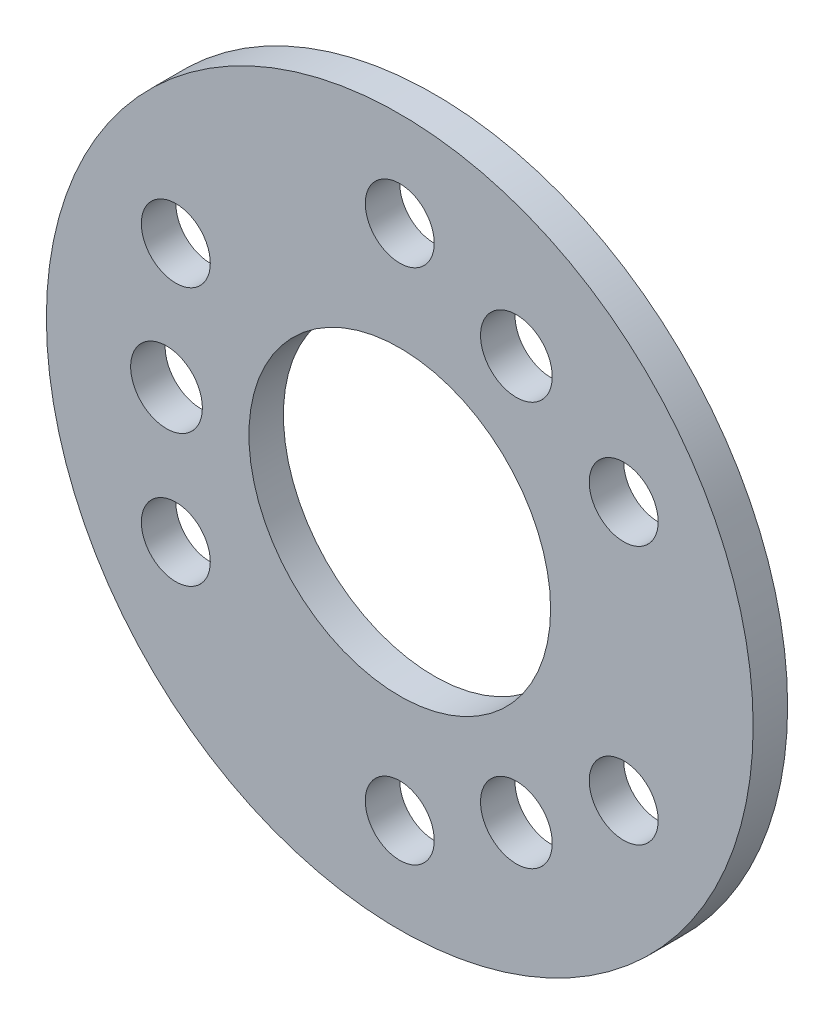
ISO-10303-21;
HEADER;
FILE_DESCRIPTION(('STEP AP214'),'2;1');
FILE_NAME('part.step','',(''),(''),'','','');
FILE_SCHEMA(('AUTOMOTIVE_DESIGN { 1 0 10303 214 1 1 1 1 }'));
ENDSEC;
DATA;
#1=APPLICATION_CONTEXT('core data for automotive mechanical design processes');
#2=APPLICATION_PROTOCOL_DEFINITION('international standard','automotive_design',2000,#1);
#3=PRODUCT_CONTEXT('',#1,'mechanical');
#4=PRODUCT('Part','Part','',(#3));
#5=PRODUCT_RELATED_PRODUCT_CATEGORY('part','',(#4));
#6=PRODUCT_DEFINITION_FORMATION('','',#4);
#7=PRODUCT_DEFINITION_CONTEXT('part definition',#1,'design');
#8=PRODUCT_DEFINITION('design','',#6,#7);
#9=PRODUCT_DEFINITION_SHAPE('','',#8);
#10=(LENGTH_UNIT() NAMED_UNIT(*) SI_UNIT(.MILLI.,.METRE.));
#11=(NAMED_UNIT(*) PLANE_ANGLE_UNIT() SI_UNIT($,.RADIAN.));
#12=(NAMED_UNIT(*) SI_UNIT($,.STERADIAN.) SOLID_ANGLE_UNIT());
#13=UNCERTAINTY_MEASURE_WITH_UNIT(LENGTH_MEASURE(1.E-05),#10,'distance_accuracy_value','');
#14=(GEOMETRIC_REPRESENTATION_CONTEXT(3) GLOBAL_UNCERTAINTY_ASSIGNED_CONTEXT((#13)) GLOBAL_UNIT_ASSIGNED_CONTEXT((#10,
#11,#12)) REPRESENTATION_CONTEXT('',''));
#15=CARTESIAN_POINT('',(0.,0.,0.));
#16=DIRECTION('',(0.,0.,1.));
#17=DIRECTION('',(1.,0.,0.));
#18=AXIS2_PLACEMENT_3D('',#15,#16,#17);
#19=CARTESIAN_POINT('',(-0.985220570796085,0.129022057079611,2.));
#20=DIRECTION('',(0.,0.,1.));
#21=DIRECTION('',(1.,0.,0.));
#22=AXIS2_PLACEMENT_3D('',#19,#20,#21);
#23=PLANE('',#22);
#24=CARTESIAN_POINT('',(5.77977942920397,11.846345770283,2.));
#25=DIRECTION('',(0.,0.,1.));
#26=DIRECTION('',(1.,0.,0.));
#27=AXIS2_PLACEMENT_3D('',#24,#25,#26);
#28=CIRCLE('',#27,2.08);
#29=CARTESIAN_POINT('',(7.85977942920397,11.846345770283,2.));
#30=VERTEX_POINT('',#29);
#31=EDGE_CURVE('E88',#30,#30,#28,.T.);
#32=ORIENTED_EDGE('',*,*,#31,.F.);
#33=EDGE_LOOP('',(#32));
#34=FACE_BOUND('',#33,.T.);
#35=CARTESIAN_POINT('',(12.0051604859704,-7.37097794292054,2.));
#36=DIRECTION('',(0.,0.,1.));
#37=DIRECTION('',(1.,0.,0.));
#38=AXIS2_PLACEMENT_3D('',#35,#36,#37);
#39=CIRCLE('',#38,2.);
#40=CARTESIAN_POINT('',(14.0051604859704,-7.37097794292054,2.));
#41=VERTEX_POINT('',#40);
#42=EDGE_CURVE('E76',#41,#41,#39,.T.);
#43=ORIENTED_EDGE('',*,*,#42,.F.);
#44=EDGE_LOOP('',(#43));
#45=FACE_BOUND('',#44,.T.);
#46=CARTESIAN_POINT('',(-0.98522057079598,15.1290220570796,2.));
#47=DIRECTION('',(0.,0.,1.));
#48=DIRECTION('',(1.,0.,0.));
#49=AXIS2_PLACEMENT_3D('',#46,#47,#48);
#50=CIRCLE('',#49,2.);
#51=CARTESIAN_POINT('',(1.01477942920402,15.1290220570796,2.));
#52=VERTEX_POINT('',#51);
#53=EDGE_CURVE('E64',#52,#52,#50,.T.);
#54=ORIENTED_EDGE('',*,*,#53,.F.);
#55=EDGE_LOOP('',(#54));
#56=FACE_BOUND('',#55,.T.);
#57=CARTESIAN_POINT('',(-13.9756016275627,-7.37097794292036,2.));
#58=DIRECTION('',(0.,0.,1.));
#59=DIRECTION('',(1.,0.,0.));
#60=AXIS2_PLACEMENT_3D('',#57,#58,#59);
#61=CIRCLE('',#60,2.);
#62=CARTESIAN_POINT('',(-11.9756016275627,-7.37097794292036,2.));
#63=VERTEX_POINT('',#62);
#64=EDGE_CURVE('E52',#63,#63,#61,.T.);
#65=ORIENTED_EDGE('',*,*,#64,.F.);
#66=EDGE_LOOP('',(#65));
#67=FACE_BOUND('',#66,.T.);
#68=CARTESIAN_POINT('',(-0.985220570796085,-14.8709779429204,2.));
#69=DIRECTION('',(0.,0.,1.));
#70=DIRECTION('',(1.,0.,0.));
#71=AXIS2_PLACEMENT_3D('',#68,#69,#70);
#72=CIRCLE('',#71,2.);
#73=CARTESIAN_POINT('',(1.01477942920391,-14.8709779429204,2.));
#74=VERTEX_POINT('',#73);
#75=EDGE_CURVE('E41',#74,#74,#72,.T.);
#76=ORIENTED_EDGE('',*,*,#75,.F.);
#77=EDGE_LOOP('',(#76));
#78=FACE_BOUND('',#77,.T.);
#79=CARTESIAN_POINT('',(-0.985220570796085,0.129022057079611,2.));
#80=DIRECTION('',(0.,0.,1.));
#81=DIRECTION('',(1.,0.,0.));
#82=AXIS2_PLACEMENT_3D('',#79,#80,#81);
#83=CIRCLE('',#82,20.5);
#84=CARTESIAN_POINT('',(19.5147794292039,0.129022057079611,2.));
#85=VERTEX_POINT('',#84);
#86=EDGE_CURVE('E10',#85,#85,#83,.T.);
#87=ORIENTED_EDGE('',*,*,#86,.T.);
#88=EDGE_LOOP('',(#87));
#89=FACE_BOUND('',#88,.T.);
#90=CARTESIAN_POINT('',(-14.5152205707961,0.129022057079611,2.));
#91=DIRECTION('',(0.,0.,1.));
#92=DIRECTION('',(1.,0.,0.));
#93=AXIS2_PLACEMENT_3D('',#90,#91,#92);
#94=CIRCLE('',#93,2.08);
#95=CARTESIAN_POINT('',(-12.4352205707961,0.129022057079611,2.));
#96=VERTEX_POINT('',#95);
#97=EDGE_CURVE('E46',#96,#96,#94,.T.);
#98=ORIENTED_EDGE('',*,*,#97,.F.);
#99=EDGE_LOOP('',(#98));
#100=FACE_BOUND('',#99,.T.);
#101=CARTESIAN_POINT('',(-13.9756016275626,7.62902205707967,2.));
#102=DIRECTION('',(0.,0.,1.));
#103=DIRECTION('',(1.,0.,0.));
#104=AXIS2_PLACEMENT_3D('',#101,#102,#103);
#105=CIRCLE('',#104,2.);
#106=CARTESIAN_POINT('',(-11.9756016275626,7.62902205707967,2.));
#107=VERTEX_POINT('',#106);
#108=EDGE_CURVE('E58',#107,#107,#105,.T.);
#109=ORIENTED_EDGE('',*,*,#108,.F.);
#110=EDGE_LOOP('',(#109));
#111=FACE_BOUND('',#110,.T.);
#112=CARTESIAN_POINT('',(12.0051604859706,7.62902205707949,2.));
#113=DIRECTION('',(0.,0.,1.));
#114=DIRECTION('',(1.,0.,0.));
#115=AXIS2_PLACEMENT_3D('',#112,#113,#114);
#116=CIRCLE('',#115,2.);
#117=CARTESIAN_POINT('',(14.0051604859706,7.62902205707949,2.));
#118=VERTEX_POINT('',#117);
#119=EDGE_CURVE('E70',#118,#118,#116,.T.);
#120=ORIENTED_EDGE('',*,*,#119,.F.);
#121=EDGE_LOOP('',(#120));
#122=FACE_BOUND('',#121,.T.);
#123=CARTESIAN_POINT('',(-0.985220570796085,0.129022057079611,2.));
#124=DIRECTION('',(0.,0.,1.));
#125=DIRECTION('',(1.,0.,0.));
#126=AXIS2_PLACEMENT_3D('',#123,#124,#125);
#127=CIRCLE('',#126,8.75);
#128=CARTESIAN_POINT('',(7.76477942920392,0.129022057079611,2.));
#129=VERTEX_POINT('',#128);
#130=EDGE_CURVE('E82',#129,#129,#127,.T.);
#131=ORIENTED_EDGE('',*,*,#130,.F.);
#132=EDGE_LOOP('',(#131));
#133=FACE_BOUND('',#132,.T.);
#134=CARTESIAN_POINT('',(5.77977942920381,-11.5883016561239,2.));
#135=DIRECTION('',(0.,0.,1.));
#136=DIRECTION('',(1.,0.,0.));
#137=AXIS2_PLACEMENT_3D('',#134,#135,#136);
#138=CIRCLE('',#137,2.08);
#139=CARTESIAN_POINT('',(7.85977942920381,-11.5883016561239,2.));
#140=VERTEX_POINT('',#139);
#141=EDGE_CURVE('E94',#140,#140,#138,.T.);
#142=ORIENTED_EDGE('',*,*,#141,.F.);
#143=EDGE_LOOP('',(#142));
#144=FACE_BOUND('',#143,.T.);
#145=ADVANCED_FACE('F30',(#34,#45,#56,#67,#78,#89,#100,#111,#122,#133,#144),#23,.T.);
#146=CARTESIAN_POINT('',(-0.985220570796085,0.129022057079611,0.));
#147=DIRECTION('',(0.,0.,1.));
#148=DIRECTION('',(1.,0.,0.));
#149=AXIS2_PLACEMENT_3D('',#146,#147,#148);
#150=PLANE('',#149);
#151=CARTESIAN_POINT('',(-0.985220570796085,0.129022057079611,0.));
#152=DIRECTION('',(0.,0.,1.));
#153=DIRECTION('',(1.,0.,0.));
#154=AXIS2_PLACEMENT_3D('',#151,#152,#153);
#155=CIRCLE('',#154,20.5);
#156=CARTESIAN_POINT('',(19.5147794292039,0.129022057079611,0.));
#157=VERTEX_POINT('',#156);
#158=EDGE_CURVE('E34',#157,#157,#155,.T.);
#159=ORIENTED_EDGE('',*,*,#158,.F.);
#160=EDGE_LOOP('',(#159));
#161=FACE_BOUND('',#160,.T.);
#162=CARTESIAN_POINT('',(-0.985220570796085,-14.8709779429204,0.));
#163=DIRECTION('',(0.,0.,1.));
#164=DIRECTION('',(1.,0.,0.));
#165=AXIS2_PLACEMENT_3D('',#162,#163,#164);
#166=CIRCLE('',#165,2.);
#167=CARTESIAN_POINT('',(1.01477942920391,-14.8709779429204,0.));
#168=VERTEX_POINT('',#167);
#169=EDGE_CURVE('E43',#168,#168,#166,.T.);
#170=ORIENTED_EDGE('',*,*,#169,.T.);
#171=EDGE_LOOP('',(#170));
#172=FACE_BOUND('',#171,.T.);
#173=CARTESIAN_POINT('',(-14.5152205707961,0.129022057079611,0.));
#174=DIRECTION('',(0.,0.,1.));
#175=DIRECTION('',(1.,0.,0.));
#176=AXIS2_PLACEMENT_3D('',#173,#174,#175);
#177=CIRCLE('',#176,2.08);
#178=CARTESIAN_POINT('',(-12.4352205707961,0.129022057079611,0.));
#179=VERTEX_POINT('',#178);
#180=EDGE_CURVE('E49',#179,#179,#177,.T.);
#181=ORIENTED_EDGE('',*,*,#180,.T.);
#182=EDGE_LOOP('',(#181));
#183=FACE_BOUND('',#182,.T.);
#184=CARTESIAN_POINT('',(-13.9756016275627,-7.37097794292036,0.));
#185=DIRECTION('',(0.,0.,1.));
#186=DIRECTION('',(1.,0.,0.));
#187=AXIS2_PLACEMENT_3D('',#184,#185,#186);
#188=CIRCLE('',#187,2.);
#189=CARTESIAN_POINT('',(-11.9756016275627,-7.37097794292036,0.));
#190=VERTEX_POINT('',#189);
#191=EDGE_CURVE('E55',#190,#190,#188,.T.);
#192=ORIENTED_EDGE('',*,*,#191,.T.);
#193=EDGE_LOOP('',(#192));
#194=FACE_BOUND('',#193,.T.);
#195=CARTESIAN_POINT('',(-13.9756016275626,7.62902205707967,0.));
#196=DIRECTION('',(0.,0.,1.));
#197=DIRECTION('',(1.,0.,0.));
#198=AXIS2_PLACEMENT_3D('',#195,#196,#197);
#199=CIRCLE('',#198,2.);
#200=CARTESIAN_POINT('',(-11.9756016275626,7.62902205707967,0.));
#201=VERTEX_POINT('',#200);
#202=EDGE_CURVE('E61',#201,#201,#199,.T.);
#203=ORIENTED_EDGE('',*,*,#202,.T.);
#204=EDGE_LOOP('',(#203));
#205=FACE_BOUND('',#204,.T.);
#206=CARTESIAN_POINT('',(-0.98522057079598,15.1290220570796,0.));
#207=DIRECTION('',(0.,0.,1.));
#208=DIRECTION('',(1.,0.,0.));
#209=AXIS2_PLACEMENT_3D('',#206,#207,#208);
#210=CIRCLE('',#209,2.);
#211=CARTESIAN_POINT('',(1.01477942920402,15.1290220570796,0.));
#212=VERTEX_POINT('',#211);
#213=EDGE_CURVE('E67',#212,#212,#210,.T.);
#214=ORIENTED_EDGE('',*,*,#213,.T.);
#215=EDGE_LOOP('',(#214));
#216=FACE_BOUND('',#215,.T.);
#217=CARTESIAN_POINT('',(12.0051604859706,7.62902205707949,0.));
#218=DIRECTION('',(0.,0.,1.));
#219=DIRECTION('',(1.,0.,0.));
#220=AXIS2_PLACEMENT_3D('',#217,#218,#219);
#221=CIRCLE('',#220,2.);
#222=CARTESIAN_POINT('',(14.0051604859706,7.62902205707949,0.));
#223=VERTEX_POINT('',#222);
#224=EDGE_CURVE('E73',#223,#223,#221,.T.);
#225=ORIENTED_EDGE('',*,*,#224,.T.);
#226=EDGE_LOOP('',(#225));
#227=FACE_BOUND('',#226,.T.);
#228=CARTESIAN_POINT('',(12.0051604859704,-7.37097794292054,0.));
#229=DIRECTION('',(0.,0.,1.));
#230=DIRECTION('',(1.,0.,0.));
#231=AXIS2_PLACEMENT_3D('',#228,#229,#230);
#232=CIRCLE('',#231,2.);
#233=CARTESIAN_POINT('',(14.0051604859704,-7.37097794292054,0.));
#234=VERTEX_POINT('',#233);
#235=EDGE_CURVE('E79',#234,#234,#232,.T.);
#236=ORIENTED_EDGE('',*,*,#235,.T.);
#237=EDGE_LOOP('',(#236));
#238=FACE_BOUND('',#237,.T.);
#239=CARTESIAN_POINT('',(-0.985220570796085,0.129022057079611,0.));
#240=DIRECTION('',(0.,0.,1.));
#241=DIRECTION('',(1.,0.,0.));
#242=AXIS2_PLACEMENT_3D('',#239,#240,#241);
#243=CIRCLE('',#242,8.75);
#244=CARTESIAN_POINT('',(7.76477942920392,0.129022057079611,0.));
#245=VERTEX_POINT('',#244);
#246=EDGE_CURVE('E85',#245,#245,#243,.T.);
#247=ORIENTED_EDGE('',*,*,#246,.T.);
#248=EDGE_LOOP('',(#247));
#249=FACE_BOUND('',#248,.T.);
#250=CARTESIAN_POINT('',(5.77977942920397,11.846345770283,0.));
#251=DIRECTION('',(0.,0.,1.));
#252=DIRECTION('',(1.,0.,0.));
#253=AXIS2_PLACEMENT_3D('',#250,#251,#252);
#254=CIRCLE('',#253,2.08);
#255=CARTESIAN_POINT('',(7.85977942920397,11.846345770283,0.));
#256=VERTEX_POINT('',#255);
#257=EDGE_CURVE('E91',#256,#256,#254,.T.);
#258=ORIENTED_EDGE('',*,*,#257,.T.);
#259=EDGE_LOOP('',(#258));
#260=FACE_BOUND('',#259,.T.);
#261=CARTESIAN_POINT('',(5.77977942920381,-11.5883016561239,0.));
#262=DIRECTION('',(0.,0.,1.));
#263=DIRECTION('',(1.,0.,0.));
#264=AXIS2_PLACEMENT_3D('',#261,#262,#263);
#265=CIRCLE('',#264,2.08);
#266=CARTESIAN_POINT('',(7.85977942920381,-11.5883016561239,0.));
#267=VERTEX_POINT('',#266);
#268=EDGE_CURVE('E97',#267,#267,#265,.T.);
#269=ORIENTED_EDGE('',*,*,#268,.T.);
#270=EDGE_LOOP('',(#269));
#271=FACE_BOUND('',#270,.T.);
#272=ADVANCED_FACE('F107',(#161,#172,#183,#194,#205,#216,#227,#238,#249,#260,#271),#150,.F.);
#273=CARTESIAN_POINT('',(-0.985220570796085,0.129022057079611,2.));
#274=DIRECTION('',(0.,0.,-1.));
#275=DIRECTION('',(-1.,0.,0.));
#276=AXIS2_PLACEMENT_3D('',#273,#274,#275);
#277=CYLINDRICAL_SURFACE('',#276,20.5);
#278=ORIENTED_EDGE('',*,*,#86,.F.);
#279=EDGE_LOOP('',(#278));
#280=FACE_BOUND('',#279,.T.);
#281=ORIENTED_EDGE('',*,*,#158,.T.);
#282=EDGE_LOOP('',(#281));
#283=FACE_BOUND('',#282,.T.);
#284=ADVANCED_FACE('F32',(#280,#283),#277,.T.);
#285=CARTESIAN_POINT('',(-0.985220570796085,-14.8709779429204,2.));
#286=DIRECTION('',(0.,0.,-1.));
#287=DIRECTION('',(-1.,0.,0.));
#288=AXIS2_PLACEMENT_3D('',#285,#286,#287);
#289=CYLINDRICAL_SURFACE('',#288,2.);
#290=ORIENTED_EDGE('',*,*,#75,.T.);
#291=EDGE_LOOP('',(#290));
#292=FACE_BOUND('',#291,.T.);
#293=ORIENTED_EDGE('',*,*,#169,.F.);
#294=EDGE_LOOP('',(#293));
#295=FACE_BOUND('',#294,.T.);
#296=ADVANCED_FACE('F117',(#292,#295),#289,.F.);
#297=CARTESIAN_POINT('',(-14.5152205707961,0.129022057079611,2.));
#298=DIRECTION('',(0.,0.,-1.));
#299=DIRECTION('',(-1.,0.,0.));
#300=AXIS2_PLACEMENT_3D('',#297,#298,#299);
#301=CYLINDRICAL_SURFACE('',#300,2.08);
#302=ORIENTED_EDGE('',*,*,#97,.T.);
#303=EDGE_LOOP('',(#302));
#304=FACE_BOUND('',#303,.T.);
#305=ORIENTED_EDGE('',*,*,#180,.F.);
#306=EDGE_LOOP('',(#305));
#307=FACE_BOUND('',#306,.T.);
#308=ADVANCED_FACE('F120',(#304,#307),#301,.F.);
#309=CARTESIAN_POINT('',(-13.9756016275627,-7.37097794292036,2.));
#310=DIRECTION('',(0.,0.,-1.));
#311=DIRECTION('',(-1.,0.,0.));
#312=AXIS2_PLACEMENT_3D('',#309,#310,#311);
#313=CYLINDRICAL_SURFACE('',#312,2.);
#314=ORIENTED_EDGE('',*,*,#64,.T.);
#315=EDGE_LOOP('',(#314));
#316=FACE_BOUND('',#315,.T.);
#317=ORIENTED_EDGE('',*,*,#191,.F.);
#318=EDGE_LOOP('',(#317));
#319=FACE_BOUND('',#318,.T.);
#320=ADVANCED_FACE('F124',(#316,#319),#313,.F.);
#321=CARTESIAN_POINT('',(-13.9756016275626,7.62902205707967,2.));
#322=DIRECTION('',(0.,0.,-1.));
#323=DIRECTION('',(-1.,0.,0.));
#324=AXIS2_PLACEMENT_3D('',#321,#322,#323);
#325=CYLINDRICAL_SURFACE('',#324,2.);
#326=ORIENTED_EDGE('',*,*,#108,.T.);
#327=EDGE_LOOP('',(#326));
#328=FACE_BOUND('',#327,.T.);
#329=ORIENTED_EDGE('',*,*,#202,.F.);
#330=EDGE_LOOP('',(#329));
#331=FACE_BOUND('',#330,.T.);
#332=ADVANCED_FACE('F128',(#328,#331),#325,.F.);
#333=CARTESIAN_POINT('',(-0.98522057079598,15.1290220570796,2.));
#334=DIRECTION('',(0.,0.,-1.));
#335=DIRECTION('',(-1.,0.,0.));
#336=AXIS2_PLACEMENT_3D('',#333,#334,#335);
#337=CYLINDRICAL_SURFACE('',#336,2.);
#338=ORIENTED_EDGE('',*,*,#53,.T.);
#339=EDGE_LOOP('',(#338));
#340=FACE_BOUND('',#339,.T.);
#341=ORIENTED_EDGE('',*,*,#213,.F.);
#342=EDGE_LOOP('',(#341));
#343=FACE_BOUND('',#342,.T.);
#344=ADVANCED_FACE('F132',(#340,#343),#337,.F.);
#345=CARTESIAN_POINT('',(12.0051604859706,7.62902205707949,2.));
#346=DIRECTION('',(0.,0.,-1.));
#347=DIRECTION('',(-1.,0.,0.));
#348=AXIS2_PLACEMENT_3D('',#345,#346,#347);
#349=CYLINDRICAL_SURFACE('',#348,2.);
#350=ORIENTED_EDGE('',*,*,#119,.T.);
#351=EDGE_LOOP('',(#350));
#352=FACE_BOUND('',#351,.T.);
#353=ORIENTED_EDGE('',*,*,#224,.F.);
#354=EDGE_LOOP('',(#353));
#355=FACE_BOUND('',#354,.T.);
#356=ADVANCED_FACE('F136',(#352,#355),#349,.F.);
#357=CARTESIAN_POINT('',(12.0051604859704,-7.37097794292054,2.));
#358=DIRECTION('',(0.,0.,-1.));
#359=DIRECTION('',(-1.,0.,0.));
#360=AXIS2_PLACEMENT_3D('',#357,#358,#359);
#361=CYLINDRICAL_SURFACE('',#360,2.);
#362=ORIENTED_EDGE('',*,*,#42,.T.);
#363=EDGE_LOOP('',(#362));
#364=FACE_BOUND('',#363,.T.);
#365=ORIENTED_EDGE('',*,*,#235,.F.);
#366=EDGE_LOOP('',(#365));
#367=FACE_BOUND('',#366,.T.);
#368=ADVANCED_FACE('F140',(#364,#367),#361,.F.);
#369=CARTESIAN_POINT('',(-0.985220570796085,0.129022057079611,2.));
#370=DIRECTION('',(0.,0.,-1.));
#371=DIRECTION('',(-1.,0.,0.));
#372=AXIS2_PLACEMENT_3D('',#369,#370,#371);
#373=CYLINDRICAL_SURFACE('',#372,8.75);
#374=ORIENTED_EDGE('',*,*,#130,.T.);
#375=EDGE_LOOP('',(#374));
#376=FACE_BOUND('',#375,.T.);
#377=ORIENTED_EDGE('',*,*,#246,.F.);
#378=EDGE_LOOP('',(#377));
#379=FACE_BOUND('',#378,.T.);
#380=ADVANCED_FACE('F144',(#376,#379),#373,.F.);
#381=CARTESIAN_POINT('',(5.77977942920397,11.846345770283,2.));
#382=DIRECTION('',(0.,0.,-1.));
#383=DIRECTION('',(-1.,0.,0.));
#384=AXIS2_PLACEMENT_3D('',#381,#382,#383);
#385=CYLINDRICAL_SURFACE('',#384,2.08);
#386=ORIENTED_EDGE('',*,*,#31,.T.);
#387=EDGE_LOOP('',(#386));
#388=FACE_BOUND('',#387,.T.);
#389=ORIENTED_EDGE('',*,*,#257,.F.);
#390=EDGE_LOOP('',(#389));
#391=FACE_BOUND('',#390,.T.);
#392=ADVANCED_FACE('F148',(#388,#391),#385,.F.);
#393=CARTESIAN_POINT('',(5.77977942920381,-11.5883016561239,2.));
#394=DIRECTION('',(0.,0.,-1.));
#395=DIRECTION('',(-1.,0.,0.));
#396=AXIS2_PLACEMENT_3D('',#393,#394,#395);
#397=CYLINDRICAL_SURFACE('',#396,2.08);
#398=ORIENTED_EDGE('',*,*,#141,.T.);
#399=EDGE_LOOP('',(#398));
#400=FACE_BOUND('',#399,.T.);
#401=ORIENTED_EDGE('',*,*,#268,.F.);
#402=EDGE_LOOP('',(#401));
#403=FACE_BOUND('',#402,.T.);
#404=ADVANCED_FACE('F103',(#400,#403),#397,.F.);
#405=CLOSED_SHELL('',(#145,#272,#284,#296,#308,#320,#332,#344,#356,#368,#380,#392,#404));
#406=MANIFOLD_SOLID_BREP('B2',#405);
#407=ADVANCED_BREP_SHAPE_REPRESENTATION('',(#18,#406),#14);
#408=SHAPE_DEFINITION_REPRESENTATION(#9,#407);
ENDSEC;
END-ISO-10303-21;
